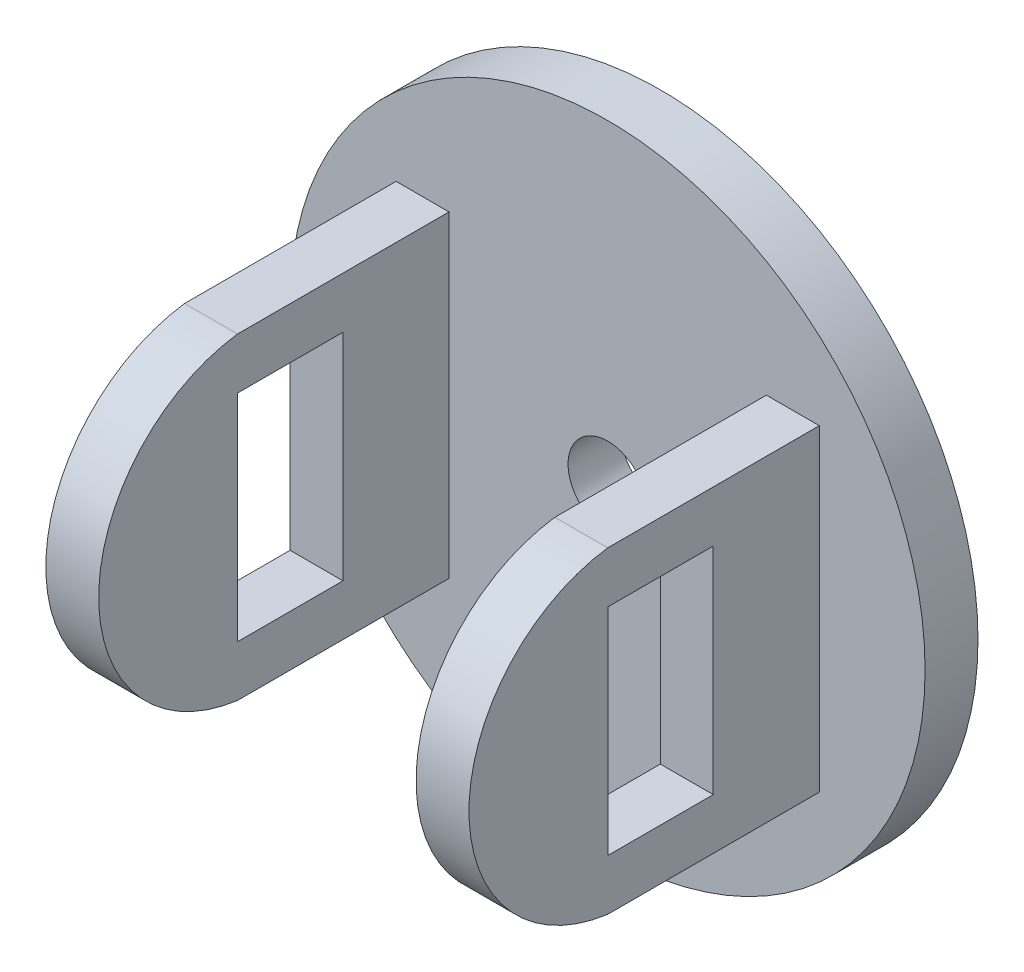
ISO-10303-21;
HEADER;
FILE_DESCRIPTION(('STEP AP214'),'2;1');
FILE_NAME('part.step','',(''),(''),'','','');
FILE_SCHEMA(('AUTOMOTIVE_DESIGN { 1 0 10303 214 1 1 1 1 }'));
ENDSEC;
DATA;
#1=APPLICATION_CONTEXT('core data for automotive mechanical design processes');
#2=APPLICATION_PROTOCOL_DEFINITION('international standard','automotive_design',2000,#1);
#3=PRODUCT_CONTEXT('',#1,'mechanical');
#4=PRODUCT('Part','Part','',(#3));
#5=PRODUCT_RELATED_PRODUCT_CATEGORY('part','',(#4));
#6=PRODUCT_DEFINITION_FORMATION('','',#4);
#7=PRODUCT_DEFINITION_CONTEXT('part definition',#1,'design');
#8=PRODUCT_DEFINITION('design','',#6,#7);
#9=PRODUCT_DEFINITION_SHAPE('','',#8);
#10=(LENGTH_UNIT() NAMED_UNIT(*) SI_UNIT(.MILLI.,.METRE.));
#11=(NAMED_UNIT(*) PLANE_ANGLE_UNIT() SI_UNIT($,.RADIAN.));
#12=(NAMED_UNIT(*) SI_UNIT($,.STERADIAN.) SOLID_ANGLE_UNIT());
#13=UNCERTAINTY_MEASURE_WITH_UNIT(LENGTH_MEASURE(1.E-05),#10,'distance_accuracy_value','');
#14=(GEOMETRIC_REPRESENTATION_CONTEXT(3) GLOBAL_UNCERTAINTY_ASSIGNED_CONTEXT((#13)) GLOBAL_UNIT_ASSIGNED_CONTEXT((#10,
#11,#12)) REPRESENTATION_CONTEXT('',''));
#15=CARTESIAN_POINT('',(0.,0.,0.));
#16=DIRECTION('',(0.,0.,1.));
#17=DIRECTION('',(1.,0.,0.));
#18=AXIS2_PLACEMENT_3D('',#15,#16,#17);
#19=CARTESIAN_POINT('',(0.,0.,10.));
#20=DIRECTION('',(0.,0.,1.));
#21=DIRECTION('',(1.,0.,0.));
#22=AXIS2_PLACEMENT_3D('',#19,#20,#21);
#23=PLANE('',#22);
#24=CARTESIAN_POINT('',(0.,0.,10.));
#25=DIRECTION('',(0.,0.,1.));
#26=DIRECTION('',(1.,0.,0.));
#27=AXIS2_PLACEMENT_3D('',#24,#25,#26);
#28=CIRCLE('',#27,7.5);
#29=CARTESIAN_POINT('',(7.5,0.,10.));
#30=VERTEX_POINT('',#29);
#31=EDGE_CURVE('E429',#30,#30,#28,.T.);
#32=ORIENTED_EDGE('',*,*,#31,.F.);
#33=EDGE_LOOP('',(#32));
#34=FACE_BOUND('',#33,.T.);
#35=CARTESIAN_POINT('',(0.,0.,10.));
#36=DIRECTION('',(0.,0.,1.));
#37=DIRECTION('',(1.,0.,0.));
#38=AXIS2_PLACEMENT_3D('',#35,#36,#37);
#39=CIRCLE('',#38,60.);
#40=CARTESIAN_POINT('',(60.,0.,10.));
#41=VERTEX_POINT('',#40);
#42=EDGE_CURVE('E11',#41,#41,#39,.T.);
#43=ORIENTED_EDGE('',*,*,#42,.T.);
#44=EDGE_LOOP('',(#43));
#45=FACE_BOUND('',#44,.T.);
#46=DIRECTION('',(0.,1.,0.));
#47=VECTOR('',#46,1.);
#48=CARTESIAN_POINT('',(30.,0.,10.));
#49=LINE('',#48,#47);
#50=CARTESIAN_POINT('',(30.,-29.9760569483455,10.));
#51=VERTEX_POINT('',#50);
#52=CARTESIAN_POINT('',(30.,30.0239430516545,10.));
#53=VERTEX_POINT('',#52);
#54=EDGE_CURVE('E300',#51,#53,#49,.T.);
#55=ORIENTED_EDGE('',*,*,#54,.T.);
#56=DIRECTION('',(-1.,0.,0.));
#57=VECTOR('',#56,1.);
#58=CARTESIAN_POINT('',(40.,30.0239430516545,10.));
#59=LINE('',#58,#57);
#60=CARTESIAN_POINT('',(40.,30.0239430516545,10.));
#61=VERTEX_POINT('',#60);
#62=EDGE_CURVE('E309',#61,#53,#59,.T.);
#63=ORIENTED_EDGE('',*,*,#62,.F.);
#64=DIRECTION('',(0.,1.,0.));
#65=VECTOR('',#64,1.);
#66=CARTESIAN_POINT('',(40.,0.,10.));
#67=LINE('',#66,#65);
#68=CARTESIAN_POINT('',(40.,-29.9760569483455,10.));
#69=VERTEX_POINT('',#68);
#70=EDGE_CURVE('E306',#69,#61,#67,.T.);
#71=ORIENTED_EDGE('',*,*,#70,.F.);
#72=DIRECTION('',(-1.,0.,0.));
#73=VECTOR('',#72,1.);
#74=CARTESIAN_POINT('',(40.,-29.9760569483455,10.));
#75=LINE('',#74,#73);
#76=EDGE_CURVE('E323',#69,#51,#75,.T.);
#77=ORIENTED_EDGE('',*,*,#76,.T.);
#78=EDGE_LOOP('',(#55,#63,#71,#77));
#79=FACE_BOUND('',#78,.T.);
#80=DIRECTION('',(0.,1.,0.));
#81=VECTOR('',#80,1.);
#82=CARTESIAN_POINT('',(-40.,-29.9760569483455,10.));
#83=LINE('',#82,#81);
#84=CARTESIAN_POINT('',(-40.,-29.9760569483455,10.));
#85=VERTEX_POINT('',#84);
#86=CARTESIAN_POINT('',(-40.,30.0239430516545,10.));
#87=VERTEX_POINT('',#86);
#88=EDGE_CURVE('E54',#85,#87,#83,.T.);
#89=ORIENTED_EDGE('',*,*,#88,.T.);
#90=DIRECTION('',(-1.,0.,0.));
#91=VECTOR('',#90,1.);
#92=CARTESIAN_POINT('',(-30.,30.0239430516545,10.));
#93=LINE('',#92,#91);
#94=CARTESIAN_POINT('',(-30.,30.0239430516545,10.));
#95=VERTEX_POINT('',#94);
#96=EDGE_CURVE('E247',#95,#87,#93,.T.);
#97=ORIENTED_EDGE('',*,*,#96,.F.);
#98=DIRECTION('',(0.,1.,0.));
#99=VECTOR('',#98,1.);
#100=CARTESIAN_POINT('',(-30.,-29.9760569483455,10.));
#101=LINE('',#100,#99);
#102=CARTESIAN_POINT('',(-30.,-29.9760569483455,10.));
#103=VERTEX_POINT('',#102);
#104=EDGE_CURVE('E211',#103,#95,#101,.T.);
#105=ORIENTED_EDGE('',*,*,#104,.F.);
#106=DIRECTION('',(-1.,0.,0.));
#107=VECTOR('',#106,1.);
#108=CARTESIAN_POINT('',(-30.,-29.9760569483455,10.));
#109=LINE('',#108,#107);
#110=EDGE_CURVE('E225',#103,#85,#109,.T.);
#111=ORIENTED_EDGE('',*,*,#110,.T.);
#112=EDGE_LOOP('',(#89,#97,#105,#111));
#113=FACE_BOUND('',#112,.T.);
#114=ADVANCED_FACE('F38',(#34,#45,#79,#113),#23,.T.);
#115=CARTESIAN_POINT('',(0.,0.,10.));
#116=DIRECTION('',(0.,0.,-1.));
#117=DIRECTION('',(-1.,0.,0.));
#118=AXIS2_PLACEMENT_3D('',#115,#116,#117);
#119=CYLINDRICAL_SURFACE('',#118,60.);
#120=ORIENTED_EDGE('',*,*,#42,.F.);
#121=EDGE_LOOP('',(#120));
#122=FACE_BOUND('',#121,.T.);
#123=CARTESIAN_POINT('',(0.,0.,0.));
#124=DIRECTION('',(0.,0.,1.));
#125=DIRECTION('',(1.,0.,0.));
#126=AXIS2_PLACEMENT_3D('',#123,#124,#125);
#127=CIRCLE('',#126,60.);
#128=CARTESIAN_POINT('',(60.,0.,0.));
#129=VERTEX_POINT('',#128);
#130=EDGE_CURVE('E42',#129,#129,#127,.T.);
#131=ORIENTED_EDGE('',*,*,#130,.T.);
#132=EDGE_LOOP('',(#131));
#133=FACE_BOUND('',#132,.T.);
#134=ADVANCED_FACE('F40',(#122,#133),#119,.T.);
#135=CARTESIAN_POINT('',(0.,0.,0.));
#136=DIRECTION('',(0.,0.,1.));
#137=DIRECTION('',(1.,0.,0.));
#138=AXIS2_PLACEMENT_3D('',#135,#136,#137);
#139=PLANE('',#138);
#140=CARTESIAN_POINT('',(0.,0.,0.));
#141=DIRECTION('',(0.,0.,1.));
#142=DIRECTION('',(1.,0.,0.));
#143=AXIS2_PLACEMENT_3D('',#140,#141,#142);
#144=CIRCLE('',#143,7.5);
#145=CARTESIAN_POINT('',(7.5,0.,0.));
#146=VERTEX_POINT('',#145);
#147=EDGE_CURVE('E194',#146,#146,#144,.T.);
#148=ORIENTED_EDGE('',*,*,#147,.T.);
#149=EDGE_LOOP('',(#148));
#150=FACE_BOUND('',#149,.T.);
#151=ORIENTED_EDGE('',*,*,#130,.F.);
#152=EDGE_LOOP('',(#151));
#153=FACE_BOUND('',#152,.T.);
#154=ADVANCED_FACE('F340',(#150,#153),#139,.F.);
#155=CARTESIAN_POINT('',(40.,0.0239430516544887,45.9529562258035));
#156=DIRECTION('',(-1.,0.,0.));
#157=DIRECTION('',(0.,0.,1.));
#158=AXIS2_PLACEMENT_3D('',#155,#156,#157);
#159=PLANE('',#158);
#160=DIRECTION('',(0.,0.,1.));
#161=VECTOR('',#160,1.);
#162=CARTESIAN_POINT('',(40.,30.0239430516545,10.));
#163=LINE('',#162,#161);
#164=CARTESIAN_POINT('',(40.,30.0239430516545,50.));
#165=VERTEX_POINT('',#164);
#166=EDGE_CURVE('E295',#61,#165,#163,.T.);
#167=ORIENTED_EDGE('',*,*,#166,.T.);
#168=CARTESIAN_POINT('',(40.,0.0239430516544887,45.9529562258035));
#169=DIRECTION('',(1.,0.,0.));
#170=DIRECTION('',(0.,0.,1.));
#171=AXIS2_PLACEMENT_3D('',#168,#169,#170);
#172=CIRCLE('',#171,30.2717452967328);
#173=CARTESIAN_POINT('',(40.,-29.9760569483455,50.));
#174=VERTEX_POINT('',#173);
#175=EDGE_CURVE('E299',#165,#174,#172,.T.);
#176=ORIENTED_EDGE('',*,*,#175,.T.);
#177=DIRECTION('',(0.,0.,-1.));
#178=VECTOR('',#177,1.);
#179=CARTESIAN_POINT('',(40.,-29.9760569483455,10.));
#180=LINE('',#179,#178);
#181=EDGE_CURVE('E303',#174,#69,#180,.T.);
#182=ORIENTED_EDGE('',*,*,#181,.T.);
#183=ORIENTED_EDGE('',*,*,#70,.T.);
#184=EDGE_LOOP('',(#167,#176,#182,#183));
#185=FACE_BOUND('',#184,.T.);
#186=DIRECTION('',(0.,1.,0.));
#187=VECTOR('',#186,1.);
#188=CARTESIAN_POINT('',(40.,20.35,30.05));
#189=LINE('',#188,#187);
#190=CARTESIAN_POINT('',(40.,-20.35,30.05));
#191=VERTEX_POINT('',#190);
#192=CARTESIAN_POINT('',(40.,20.35,30.05));
#193=VERTEX_POINT('',#192);
#194=EDGE_CURVE('E252',#191,#193,#189,.T.);
#195=ORIENTED_EDGE('',*,*,#194,.F.);
#196=DIRECTION('',(0.,0.,-1.));
#197=VECTOR('',#196,1.);
#198=CARTESIAN_POINT('',(40.,-20.35,49.95));
#199=LINE('',#198,#197);
#200=CARTESIAN_POINT('',(40.,-20.35,49.95));
#201=VERTEX_POINT('',#200);
#202=EDGE_CURVE('E263',#201,#191,#199,.T.);
#203=ORIENTED_EDGE('',*,*,#202,.F.);
#204=DIRECTION('',(0.,-1.,0.));
#205=VECTOR('',#204,1.);
#206=CARTESIAN_POINT('',(40.,20.35,49.95));
#207=LINE('',#206,#205);
#208=CARTESIAN_POINT('',(40.,20.35,49.95));
#209=VERTEX_POINT('',#208);
#210=EDGE_CURVE('E259',#209,#201,#207,.T.);
#211=ORIENTED_EDGE('',*,*,#210,.F.);
#212=DIRECTION('',(0.,0.,1.));
#213=VECTOR('',#212,1.);
#214=CARTESIAN_POINT('',(40.,20.35,49.95));
#215=LINE('',#214,#213);
#216=EDGE_CURVE('E255',#193,#209,#215,.T.);
#217=ORIENTED_EDGE('',*,*,#216,.F.);
#218=EDGE_LOOP('',(#195,#203,#211,#217));
#219=FACE_BOUND('',#218,.T.);
#220=ADVANCED_FACE('F342',(#185,#219),#159,.F.);
#221=CARTESIAN_POINT('',(30.,0.0239430516544887,45.9529562258035));
#222=DIRECTION('',(-1.,0.,0.));
#223=DIRECTION('',(0.,0.,1.));
#224=AXIS2_PLACEMENT_3D('',#221,#222,#223);
#225=PLANE('',#224);
#226=DIRECTION('',(0.,0.,1.));
#227=VECTOR('',#226,1.);
#228=CARTESIAN_POINT('',(30.,30.0239430516545,10.));
#229=LINE('',#228,#227);
#230=CARTESIAN_POINT('',(30.,30.0239430516545,50.));
#231=VERTEX_POINT('',#230);
#232=EDGE_CURVE('E294',#53,#231,#229,.T.);
#233=ORIENTED_EDGE('',*,*,#232,.F.);
#234=ORIENTED_EDGE('',*,*,#54,.F.);
#235=DIRECTION('',(0.,0.,-1.));
#236=VECTOR('',#235,1.);
#237=CARTESIAN_POINT('',(30.,-29.9760569483455,10.));
#238=LINE('',#237,#236);
#239=CARTESIAN_POINT('',(30.,-29.9760569483455,50.));
#240=VERTEX_POINT('',#239);
#241=EDGE_CURVE('E62',#240,#51,#238,.T.);
#242=ORIENTED_EDGE('',*,*,#241,.F.);
#243=CARTESIAN_POINT('',(30.,0.0239430516544887,45.9529562258035));
#244=DIRECTION('',(1.,0.,0.));
#245=DIRECTION('',(0.,0.,1.));
#246=AXIS2_PLACEMENT_3D('',#243,#244,#245);
#247=CIRCLE('',#246,30.2717452967328);
#248=EDGE_CURVE('E313',#231,#240,#247,.T.);
#249=ORIENTED_EDGE('',*,*,#248,.F.);
#250=EDGE_LOOP('',(#233,#234,#242,#249));
#251=FACE_BOUND('',#250,.T.);
#252=DIRECTION('',(0.,0.,-1.));
#253=VECTOR('',#252,1.);
#254=CARTESIAN_POINT('',(30.,-20.35,49.95));
#255=LINE('',#254,#253);
#256=CARTESIAN_POINT('',(30.,-20.35,49.95));
#257=VERTEX_POINT('',#256);
#258=CARTESIAN_POINT('',(30.,-20.35,30.05));
#259=VERTEX_POINT('',#258);
#260=EDGE_CURVE('E256',#257,#259,#255,.T.);
#261=ORIENTED_EDGE('',*,*,#260,.T.);
#262=DIRECTION('',(0.,1.,0.));
#263=VECTOR('',#262,1.);
#264=CARTESIAN_POINT('',(30.,20.35,30.05));
#265=LINE('',#264,#263);
#266=CARTESIAN_POINT('',(30.,20.35,30.05));
#267=VERTEX_POINT('',#266);
#268=EDGE_CURVE('E251',#259,#267,#265,.T.);
#269=ORIENTED_EDGE('',*,*,#268,.T.);
#270=DIRECTION('',(0.,0.,1.));
#271=VECTOR('',#270,1.);
#272=CARTESIAN_POINT('',(30.,20.35,49.95));
#273=LINE('',#272,#271);
#274=CARTESIAN_POINT('',(30.,20.35,49.95));
#275=VERTEX_POINT('',#274);
#276=EDGE_CURVE('E270',#267,#275,#273,.T.);
#277=ORIENTED_EDGE('',*,*,#276,.T.);
#278=DIRECTION('',(0.,-1.,0.));
#279=VECTOR('',#278,1.);
#280=CARTESIAN_POINT('',(30.,20.35,49.95));
#281=LINE('',#280,#279);
#282=EDGE_CURVE('E274',#275,#257,#281,.T.);
#283=ORIENTED_EDGE('',*,*,#282,.T.);
#284=EDGE_LOOP('',(#261,#269,#277,#283));
#285=FACE_BOUND('',#284,.T.);
#286=ADVANCED_FACE('F349',(#251,#285),#225,.T.);
#287=CARTESIAN_POINT('',(40.,30.0239430516545,10.));
#288=DIRECTION('',(0.,-1.,0.));
#289=DIRECTION('',(0.,0.,-1.));
#290=AXIS2_PLACEMENT_3D('',#287,#288,#289);
#291=PLANE('',#290);
#292=ORIENTED_EDGE('',*,*,#232,.T.);
#293=DIRECTION('',(-1.,0.,0.));
#294=VECTOR('',#293,1.);
#295=CARTESIAN_POINT('',(40.,30.0239430516545,50.));
#296=LINE('',#295,#294);
#297=EDGE_CURVE('E330',#165,#231,#296,.T.);
#298=ORIENTED_EDGE('',*,*,#297,.F.);
#299=ORIENTED_EDGE('',*,*,#166,.F.);
#300=ORIENTED_EDGE('',*,*,#62,.T.);
#301=EDGE_LOOP('',(#292,#298,#299,#300));
#302=FACE_BOUND('',#301,.T.);
#303=ADVANCED_FACE('F363',(#302),#291,.F.);
#304=CARTESIAN_POINT('',(40.,0.0239430516544887,45.9529562258035));
#305=DIRECTION('',(-1.,0.,0.));
#306=DIRECTION('',(0.,0.,1.));
#307=AXIS2_PLACEMENT_3D('',#304,#305,#306);
#308=CYLINDRICAL_SURFACE('',#307,30.2717452967328);
#309=ORIENTED_EDGE('',*,*,#248,.T.);
#310=DIRECTION('',(-1.,0.,0.));
#311=VECTOR('',#310,1.);
#312=CARTESIAN_POINT('',(40.,-29.9760569483455,50.));
#313=LINE('',#312,#311);
#314=EDGE_CURVE('E327',#174,#240,#313,.T.);
#315=ORIENTED_EDGE('',*,*,#314,.F.);
#316=ORIENTED_EDGE('',*,*,#175,.F.);
#317=ORIENTED_EDGE('',*,*,#297,.T.);
#318=EDGE_LOOP('',(#309,#315,#316,#317));
#319=FACE_BOUND('',#318,.T.);
#320=ADVANCED_FACE('F366',(#319),#308,.T.);
#321=CARTESIAN_POINT('',(40.,-29.9760569483455,10.));
#322=DIRECTION('',(0.,1.,0.));
#323=DIRECTION('',(0.,0.,1.));
#324=AXIS2_PLACEMENT_3D('',#321,#322,#323);
#325=PLANE('',#324);
#326=ORIENTED_EDGE('',*,*,#241,.T.);
#327=ORIENTED_EDGE('',*,*,#76,.F.);
#328=ORIENTED_EDGE('',*,*,#181,.F.);
#329=ORIENTED_EDGE('',*,*,#314,.T.);
#330=EDGE_LOOP('',(#326,#327,#328,#329));
#331=FACE_BOUND('',#330,.T.);
#332=ADVANCED_FACE('F370',(#331),#325,.F.);
#333=CARTESIAN_POINT('',(40.,20.35,30.05));
#334=DIRECTION('',(0.,0.,1.));
#335=DIRECTION('',(0.,-1.,0.));
#336=AXIS2_PLACEMENT_3D('',#333,#334,#335);
#337=PLANE('',#336);
#338=ORIENTED_EDGE('',*,*,#268,.F.);
#339=DIRECTION('',(-1.,0.,0.));
#340=VECTOR('',#339,1.);
#341=CARTESIAN_POINT('',(40.,-20.35,30.05));
#342=LINE('',#341,#340);
#343=EDGE_CURVE('E266',#191,#259,#342,.T.);
#344=ORIENTED_EDGE('',*,*,#343,.F.);
#345=ORIENTED_EDGE('',*,*,#194,.T.);
#346=DIRECTION('',(-1.,0.,0.));
#347=VECTOR('',#346,1.);
#348=CARTESIAN_POINT('',(40.,20.35,30.05));
#349=LINE('',#348,#347);
#350=EDGE_CURVE('E290',#193,#267,#349,.T.);
#351=ORIENTED_EDGE('',*,*,#350,.T.);
#352=EDGE_LOOP('',(#338,#344,#345,#351));
#353=FACE_BOUND('',#352,.T.);
#354=ADVANCED_FACE('F373',(#353),#337,.T.);
#355=CARTESIAN_POINT('',(40.,20.35,49.95));
#356=DIRECTION('',(0.,-1.,0.));
#357=DIRECTION('',(0.,0.,-1.));
#358=AXIS2_PLACEMENT_3D('',#355,#356,#357);
#359=PLANE('',#358);
#360=ORIENTED_EDGE('',*,*,#276,.F.);
#361=ORIENTED_EDGE('',*,*,#350,.F.);
#362=ORIENTED_EDGE('',*,*,#216,.T.);
#363=DIRECTION('',(-1.,0.,0.));
#364=VECTOR('',#363,1.);
#365=CARTESIAN_POINT('',(40.,20.35,49.95));
#366=LINE('',#365,#364);
#367=EDGE_CURVE('E287',#209,#275,#366,.T.);
#368=ORIENTED_EDGE('',*,*,#367,.T.);
#369=EDGE_LOOP('',(#360,#361,#362,#368));
#370=FACE_BOUND('',#369,.T.);
#371=ADVANCED_FACE('F379',(#370),#359,.T.);
#372=CARTESIAN_POINT('',(40.,20.35,49.95));
#373=DIRECTION('',(0.,0.,-1.));
#374=DIRECTION('',(-1.,0.,0.));
#375=AXIS2_PLACEMENT_3D('',#372,#373,#374);
#376=PLANE('',#375);
#377=ORIENTED_EDGE('',*,*,#282,.F.);
#378=ORIENTED_EDGE('',*,*,#367,.F.);
#379=ORIENTED_EDGE('',*,*,#210,.T.);
#380=DIRECTION('',(-1.,0.,0.));
#381=VECTOR('',#380,1.);
#382=CARTESIAN_POINT('',(40.,-20.35,49.95));
#383=LINE('',#382,#381);
#384=EDGE_CURVE('E284',#201,#257,#383,.T.);
#385=ORIENTED_EDGE('',*,*,#384,.T.);
#386=EDGE_LOOP('',(#377,#378,#379,#385));
#387=FACE_BOUND('',#386,.T.);
#388=ADVANCED_FACE('F383',(#387),#376,.T.);
#389=CARTESIAN_POINT('',(40.,-20.35,49.95));
#390=DIRECTION('',(0.,1.,0.));
#391=DIRECTION('',(0.,0.,1.));
#392=AXIS2_PLACEMENT_3D('',#389,#390,#391);
#393=PLANE('',#392);
#394=ORIENTED_EDGE('',*,*,#260,.F.);
#395=ORIENTED_EDGE('',*,*,#384,.F.);
#396=ORIENTED_EDGE('',*,*,#202,.T.);
#397=ORIENTED_EDGE('',*,*,#343,.T.);
#398=EDGE_LOOP('',(#394,#395,#396,#397));
#399=FACE_BOUND('',#398,.T.);
#400=ADVANCED_FACE('F387',(#399),#393,.T.);
#401=CARTESIAN_POINT('',(-30.,0.0239430516544887,45.9529562258035));
#402=DIRECTION('',(1.,0.,0.));
#403=DIRECTION('',(0.,0.,-1.));
#404=AXIS2_PLACEMENT_3D('',#401,#402,#403);
#405=PLANE('',#404);
#406=ORIENTED_EDGE('',*,*,#104,.T.);
#407=DIRECTION('',(0.,0.,1.));
#408=VECTOR('',#407,1.);
#409=CARTESIAN_POINT('',(-30.,30.0239430516545,10.));
#410=LINE('',#409,#408);
#411=CARTESIAN_POINT('',(-30.,30.0239430516545,50.));
#412=VERTEX_POINT('',#411);
#413=EDGE_CURVE('E215',#95,#412,#410,.T.);
#414=ORIENTED_EDGE('',*,*,#413,.T.);
#415=CARTESIAN_POINT('',(-30.,0.0239430516544887,45.9529562258035));
#416=DIRECTION('',(1.,0.,0.));
#417=DIRECTION('',(0.,0.,-1.));
#418=AXIS2_PLACEMENT_3D('',#415,#416,#417);
#419=CIRCLE('',#418,30.2717452967328);
#420=CARTESIAN_POINT('',(-30.,-29.9760569483455,50.));
#421=VERTEX_POINT('',#420);
#422=EDGE_CURVE('E219',#412,#421,#419,.T.);
#423=ORIENTED_EDGE('',*,*,#422,.T.);
#424=DIRECTION('',(0.,0.,-1.));
#425=VECTOR('',#424,1.);
#426=CARTESIAN_POINT('',(-30.,-29.9760569483455,50.));
#427=LINE('',#426,#425);
#428=EDGE_CURVE('E222',#421,#103,#427,.T.);
#429=ORIENTED_EDGE('',*,*,#428,.T.);
#430=EDGE_LOOP('',(#406,#414,#423,#429));
#431=FACE_BOUND('',#430,.T.);
#432=DIRECTION('',(0.,0.,-1.));
#433=VECTOR('',#432,1.);
#434=CARTESIAN_POINT('',(-30.,-20.35,49.95));
#435=LINE('',#434,#433);
#436=CARTESIAN_POINT('',(-30.,-20.35,49.95));
#437=VERTEX_POINT('',#436);
#438=CARTESIAN_POINT('',(-30.,-20.35,30.05));
#439=VERTEX_POINT('',#438);
#440=EDGE_CURVE('E167',#437,#439,#435,.T.);
#441=ORIENTED_EDGE('',*,*,#440,.F.);
#442=DIRECTION('',(0.,-1.,0.));
#443=VECTOR('',#442,1.);
#444=CARTESIAN_POINT('',(-30.,20.35,49.95));
#445=LINE('',#444,#443);
#446=CARTESIAN_POINT('',(-30.,20.35,49.95));
#447=VERTEX_POINT('',#446);
#448=EDGE_CURVE('E156',#447,#437,#445,.T.);
#449=ORIENTED_EDGE('',*,*,#448,.F.);
#450=DIRECTION('',(0.,0.,1.));
#451=VECTOR('',#450,1.);
#452=CARTESIAN_POINT('',(-30.,20.35,30.05));
#453=LINE('',#452,#451);
#454=CARTESIAN_POINT('',(-30.,20.35,30.05));
#455=VERTEX_POINT('',#454);
#456=EDGE_CURVE('E185',#455,#447,#453,.T.);
#457=ORIENTED_EDGE('',*,*,#456,.F.);
#458=DIRECTION('',(0.,1.,0.));
#459=VECTOR('',#458,1.);
#460=CARTESIAN_POINT('',(-30.,-20.35,30.05));
#461=LINE('',#460,#459);
#462=EDGE_CURVE('E181',#439,#455,#461,.T.);
#463=ORIENTED_EDGE('',*,*,#462,.F.);
#464=EDGE_LOOP('',(#441,#449,#457,#463));
#465=FACE_BOUND('',#464,.T.);
#466=ADVANCED_FACE('F179',(#431,#465),#405,.T.);
#467=CARTESIAN_POINT('',(-40.,0.0239430516544887,45.9529562258035));
#468=DIRECTION('',(1.,0.,0.));
#469=DIRECTION('',(0.,0.,-1.));
#470=AXIS2_PLACEMENT_3D('',#467,#468,#469);
#471=PLANE('',#470);
#472=ORIENTED_EDGE('',*,*,#88,.F.);
#473=DIRECTION('',(0.,0.,-1.));
#474=VECTOR('',#473,1.);
#475=CARTESIAN_POINT('',(-40.,-29.9760569483455,50.));
#476=LINE('',#475,#474);
#477=CARTESIAN_POINT('',(-40.,-29.9760569483455,50.));
#478=VERTEX_POINT('',#477);
#479=EDGE_CURVE('E216',#478,#85,#476,.T.);
#480=ORIENTED_EDGE('',*,*,#479,.F.);
#481=CARTESIAN_POINT('',(-40.,0.0239430516544887,45.9529562258035));
#482=DIRECTION('',(1.,0.,0.));
#483=DIRECTION('',(0.,0.,-1.));
#484=AXIS2_PLACEMENT_3D('',#481,#482,#483);
#485=CIRCLE('',#484,30.2717452967328);
#486=CARTESIAN_POINT('',(-40.,30.0239430516545,50.));
#487=VERTEX_POINT('',#486);
#488=EDGE_CURVE('E231',#487,#478,#485,.T.);
#489=ORIENTED_EDGE('',*,*,#488,.F.);
#490=DIRECTION('',(0.,0.,1.));
#491=VECTOR('',#490,1.);
#492=CARTESIAN_POINT('',(-40.,30.0239430516545,10.));
#493=LINE('',#492,#491);
#494=EDGE_CURVE('E228',#87,#487,#493,.T.);
#495=ORIENTED_EDGE('',*,*,#494,.F.);
#496=EDGE_LOOP('',(#472,#480,#489,#495));
#497=FACE_BOUND('',#496,.T.);
#498=DIRECTION('',(0.,-1.,0.));
#499=VECTOR('',#498,1.);
#500=CARTESIAN_POINT('',(-40.,20.35,49.95));
#501=LINE('',#500,#499);
#502=CARTESIAN_POINT('',(-40.,20.35,49.95));
#503=VERTEX_POINT('',#502);
#504=CARTESIAN_POINT('',(-40.,-20.35,49.95));
#505=VERTEX_POINT('',#504);
#506=EDGE_CURVE('E191',#503,#505,#501,.T.);
#507=ORIENTED_EDGE('',*,*,#506,.T.);
#508=DIRECTION('',(0.,0.,-1.));
#509=VECTOR('',#508,1.);
#510=CARTESIAN_POINT('',(-40.,-20.35,49.95));
#511=LINE('',#510,#509);
#512=CARTESIAN_POINT('',(-40.,-20.35,30.05));
#513=VERTEX_POINT('',#512);
#514=EDGE_CURVE('E174',#505,#513,#511,.T.);
#515=ORIENTED_EDGE('',*,*,#514,.T.);
#516=DIRECTION('',(0.,1.,0.));
#517=VECTOR('',#516,1.);
#518=CARTESIAN_POINT('',(-40.,-20.35,30.05));
#519=LINE('',#518,#517);
#520=CARTESIAN_POINT('',(-40.,20.35,30.05));
#521=VERTEX_POINT('',#520);
#522=EDGE_CURVE('E197',#513,#521,#519,.T.);
#523=ORIENTED_EDGE('',*,*,#522,.T.);
#524=DIRECTION('',(0.,0.,1.));
#525=VECTOR('',#524,1.);
#526=CARTESIAN_POINT('',(-40.,20.35,30.05));
#527=LINE('',#526,#525);
#528=EDGE_CURVE('E168',#521,#503,#527,.T.);
#529=ORIENTED_EDGE('',*,*,#528,.T.);
#530=EDGE_LOOP('',(#507,#515,#523,#529));
#531=FACE_BOUND('',#530,.T.);
#532=ADVANCED_FACE('F396',(#497,#531),#471,.F.);
#533=CARTESIAN_POINT('',(-30.,30.0239430516545,10.));
#534=DIRECTION('',(0.,-1.,0.));
#535=DIRECTION('',(0.,0.,-1.));
#536=AXIS2_PLACEMENT_3D('',#533,#534,#535);
#537=PLANE('',#536);
#538=ORIENTED_EDGE('',*,*,#494,.T.);
#539=DIRECTION('',(-1.,0.,0.));
#540=VECTOR('',#539,1.);
#541=CARTESIAN_POINT('',(-30.,30.0239430516545,50.));
#542=LINE('',#541,#540);
#543=EDGE_CURVE('E243',#412,#487,#542,.T.);
#544=ORIENTED_EDGE('',*,*,#543,.F.);
#545=ORIENTED_EDGE('',*,*,#413,.F.);
#546=ORIENTED_EDGE('',*,*,#96,.T.);
#547=EDGE_LOOP('',(#538,#544,#545,#546));
#548=FACE_BOUND('',#547,.T.);
#549=ADVANCED_FACE('F392',(#548),#537,.F.);
#550=CARTESIAN_POINT('',(-30.,0.0239430516544887,45.9529562258035));
#551=DIRECTION('',(-1.,0.,0.));
#552=DIRECTION('',(0.,0.,1.));
#553=AXIS2_PLACEMENT_3D('',#550,#551,#552);
#554=CYLINDRICAL_SURFACE('',#553,30.2717452967328);
#555=ORIENTED_EDGE('',*,*,#488,.T.);
#556=DIRECTION('',(-1.,0.,0.));
#557=VECTOR('',#556,1.);
#558=CARTESIAN_POINT('',(-30.,-29.9760569483455,50.));
#559=LINE('',#558,#557);
#560=EDGE_CURVE('E239',#421,#478,#559,.T.);
#561=ORIENTED_EDGE('',*,*,#560,.F.);
#562=ORIENTED_EDGE('',*,*,#422,.F.);
#563=ORIENTED_EDGE('',*,*,#543,.T.);
#564=EDGE_LOOP('',(#555,#561,#562,#563));
#565=FACE_BOUND('',#564,.T.);
#566=ADVANCED_FACE('F395',(#565),#554,.T.);
#567=CARTESIAN_POINT('',(-30.,-29.9760569483455,50.));
#568=DIRECTION('',(0.,1.,0.));
#569=DIRECTION('',(0.,0.,1.));
#570=AXIS2_PLACEMENT_3D('',#567,#568,#569);
#571=PLANE('',#570);
#572=ORIENTED_EDGE('',*,*,#479,.T.);
#573=ORIENTED_EDGE('',*,*,#110,.F.);
#574=ORIENTED_EDGE('',*,*,#428,.F.);
#575=ORIENTED_EDGE('',*,*,#560,.T.);
#576=EDGE_LOOP('',(#572,#573,#574,#575));
#577=FACE_BOUND('',#576,.T.);
#578=ADVANCED_FACE('F400',(#577),#571,.F.);
#579=CARTESIAN_POINT('',(-30.,20.35,49.95));
#580=DIRECTION('',(0.,0.,-1.));
#581=DIRECTION('',(-1.,0.,0.));
#582=AXIS2_PLACEMENT_3D('',#579,#580,#581);
#583=PLANE('',#582);
#584=ORIENTED_EDGE('',*,*,#506,.F.);
#585=DIRECTION('',(-1.,0.,0.));
#586=VECTOR('',#585,1.);
#587=CARTESIAN_POINT('',(-30.,20.35,49.95));
#588=LINE('',#587,#586);
#589=EDGE_CURVE('E162',#447,#503,#588,.T.);
#590=ORIENTED_EDGE('',*,*,#589,.F.);
#591=ORIENTED_EDGE('',*,*,#448,.T.);
#592=DIRECTION('',(-1.,0.,0.));
#593=VECTOR('',#592,1.);
#594=CARTESIAN_POINT('',(-30.,-20.35,49.95));
#595=LINE('',#594,#593);
#596=EDGE_CURVE('E159',#437,#505,#595,.T.);
#597=ORIENTED_EDGE('',*,*,#596,.T.);
#598=EDGE_LOOP('',(#584,#590,#591,#597));
#599=FACE_BOUND('',#598,.T.);
#600=ADVANCED_FACE('F158',(#599),#583,.T.);
#601=CARTESIAN_POINT('',(-30.,-20.35,49.95));
#602=DIRECTION('',(0.,1.,0.));
#603=DIRECTION('',(0.,0.,1.));
#604=AXIS2_PLACEMENT_3D('',#601,#602,#603);
#605=PLANE('',#604);
#606=ORIENTED_EDGE('',*,*,#514,.F.);
#607=ORIENTED_EDGE('',*,*,#596,.F.);
#608=ORIENTED_EDGE('',*,*,#440,.T.);
#609=DIRECTION('',(-1.,0.,0.));
#610=VECTOR('',#609,1.);
#611=CARTESIAN_POINT('',(-30.,-20.35,30.05));
#612=LINE('',#611,#610);
#613=EDGE_CURVE('E176',#439,#513,#612,.T.);
#614=ORIENTED_EDGE('',*,*,#613,.T.);
#615=EDGE_LOOP('',(#606,#607,#608,#614));
#616=FACE_BOUND('',#615,.T.);
#617=ADVANCED_FACE('F171',(#616),#605,.T.);
#618=CARTESIAN_POINT('',(-30.,-20.35,30.05));
#619=DIRECTION('',(0.,0.,1.));
#620=DIRECTION('',(0.,-1.,0.));
#621=AXIS2_PLACEMENT_3D('',#618,#619,#620);
#622=PLANE('',#621);
#623=ORIENTED_EDGE('',*,*,#522,.F.);
#624=ORIENTED_EDGE('',*,*,#613,.F.);
#625=ORIENTED_EDGE('',*,*,#462,.T.);
#626=DIRECTION('',(-1.,0.,0.));
#627=VECTOR('',#626,1.);
#628=CARTESIAN_POINT('',(-30.,20.35,30.05));
#629=LINE('',#628,#627);
#630=EDGE_CURVE('E206',#455,#521,#629,.T.);
#631=ORIENTED_EDGE('',*,*,#630,.T.);
#632=EDGE_LOOP('',(#623,#624,#625,#631));
#633=FACE_BOUND('',#632,.T.);
#634=ADVANCED_FACE('F414',(#633),#622,.T.);
#635=CARTESIAN_POINT('',(-30.,20.35,30.05));
#636=DIRECTION('',(0.,-1.,0.));
#637=DIRECTION('',(0.,0.,-1.));
#638=AXIS2_PLACEMENT_3D('',#635,#636,#637);
#639=PLANE('',#638);
#640=ORIENTED_EDGE('',*,*,#528,.F.);
#641=ORIENTED_EDGE('',*,*,#630,.F.);
#642=ORIENTED_EDGE('',*,*,#456,.T.);
#643=ORIENTED_EDGE('',*,*,#589,.T.);
#644=EDGE_LOOP('',(#640,#641,#642,#643));
#645=FACE_BOUND('',#644,.T.);
#646=ADVANCED_FACE('F417',(#645),#639,.T.);
#647=CARTESIAN_POINT('',(0.,0.,0.));
#648=DIRECTION('',(0.,0.,1.));
#649=DIRECTION('',(1.,0.,0.));
#650=AXIS2_PLACEMENT_3D('',#647,#648,#649);
#651=CYLINDRICAL_SURFACE('',#650,7.5);
#652=ORIENTED_EDGE('',*,*,#147,.F.);
#653=EDGE_LOOP('',(#652));
#654=FACE_BOUND('',#653,.T.);
#655=ORIENTED_EDGE('',*,*,#31,.T.);
#656=EDGE_LOOP('',(#655));
#657=FACE_BOUND('',#656,.T.);
#658=ADVANCED_FACE('F421',(#654,#657),#651,.F.);
#659=CLOSED_SHELL('',(#114,#134,#154,#220,#286,#303,#320,#332,#354,#371,#388,#400,#466,#532,
#549,#566,#578,#600,#617,#634,#646,#658));
#660=MANIFOLD_SOLID_BREP('B2',#659);
#661=ADVANCED_BREP_SHAPE_REPRESENTATION('',(#18,#660),#14);
#662=SHAPE_DEFINITION_REPRESENTATION(#9,#661);
ENDSEC;
END-ISO-10303-21;
